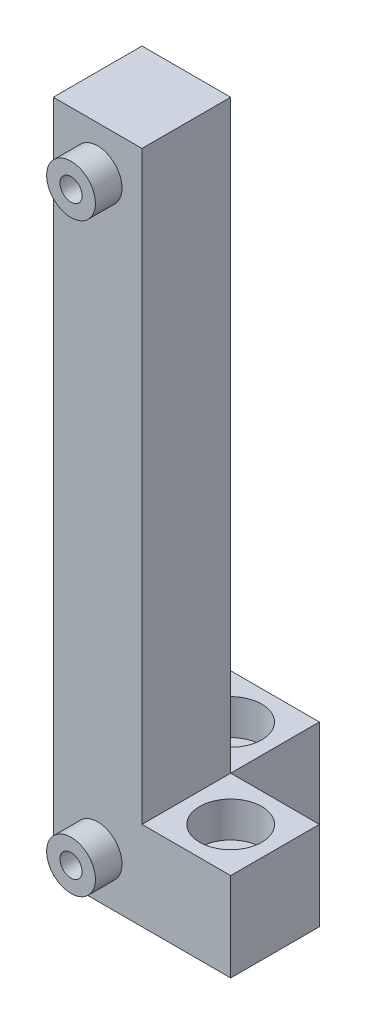
ISO-10303-21;
HEADER;
FILE_DESCRIPTION(('STEP AP214'),'2;1');
FILE_NAME('part.step','',(''),(''),'','','');
FILE_SCHEMA(('AUTOMOTIVE_DESIGN { 1 0 10303 214 1 1 1 1 }'));
ENDSEC;
DATA;
#1=APPLICATION_CONTEXT('core data for automotive mechanical design processes');
#2=APPLICATION_PROTOCOL_DEFINITION('international standard','automotive_design',2000,#1);
#3=PRODUCT_CONTEXT('',#1,'mechanical');
#4=PRODUCT('Part','Part','',(#3));
#5=PRODUCT_RELATED_PRODUCT_CATEGORY('part','',(#4));
#6=PRODUCT_DEFINITION_FORMATION('','',#4);
#7=PRODUCT_DEFINITION_CONTEXT('part definition',#1,'design');
#8=PRODUCT_DEFINITION('design','',#6,#7);
#9=PRODUCT_DEFINITION_SHAPE('','',#8);
#10=(LENGTH_UNIT() NAMED_UNIT(*) SI_UNIT(.MILLI.,.METRE.));
#11=(NAMED_UNIT(*) PLANE_ANGLE_UNIT() SI_UNIT($,.RADIAN.));
#12=(NAMED_UNIT(*) SI_UNIT($,.STERADIAN.) SOLID_ANGLE_UNIT());
#13=UNCERTAINTY_MEASURE_WITH_UNIT(LENGTH_MEASURE(1.E-05),#10,'distance_accuracy_value','');
#14=(GEOMETRIC_REPRESENTATION_CONTEXT(3) GLOBAL_UNCERTAINTY_ASSIGNED_CONTEXT((#13)) GLOBAL_UNIT_ASSIGNED_CONTEXT((#10,
#11,#12)) REPRESENTATION_CONTEXT('',''));
#15=CARTESIAN_POINT('',(0.,0.,0.));
#16=DIRECTION('',(0.,0.,1.));
#17=DIRECTION('',(1.,0.,0.));
#18=AXIS2_PLACEMENT_3D('',#15,#16,#17);
#19=CARTESIAN_POINT('',(5.,-0.000999999999999265,-5.));
#20=DIRECTION('',(0.,1.,0.));
#21=DIRECTION('',(0.,0.,1.));
#22=AXIS2_PLACEMENT_3D('',#19,#20,#21);
#23=CYLINDRICAL_SURFACE('',#22,1.75);
#24=CARTESIAN_POINT('',(5.,0.,-5.));
#25=DIRECTION('',(0.,1.,0.));
#26=DIRECTION('',(-1.,0.,0.));
#27=AXIS2_PLACEMENT_3D('',#24,#25,#26);
#28=CIRCLE('',#27,1.75);
#29=CARTESIAN_POINT('',(3.25,0.,-5.));
#30=VERTEX_POINT('',#29);
#31=EDGE_CURVE('E201',#30,#30,#28,.F.);
#32=ORIENTED_EDGE('',*,*,#31,.T.);
#33=EDGE_LOOP('',(#32));
#34=FACE_BOUND('',#33,.T.);
#35=CARTESIAN_POINT('',(5.,6.,-5.));
#36=DIRECTION('',(0.,1.,0.));
#37=DIRECTION('',(0.,0.,1.));
#38=AXIS2_PLACEMENT_3D('',#35,#36,#37);
#39=CIRCLE('',#38,1.75);
#40=CARTESIAN_POINT('',(5.,6.,-3.25));
#41=VERTEX_POINT('',#40);
#42=EDGE_CURVE('E38',#41,#41,#39,.F.);
#43=ORIENTED_EDGE('',*,*,#42,.F.);
#44=EDGE_LOOP('',(#43));
#45=FACE_BOUND('',#44,.T.);
#46=ADVANCED_FACE('F34',(#34,#45),#23,.F.);
#47=CARTESIAN_POINT('',(15.,-0.000999999999999265,5.));
#48=DIRECTION('',(0.,1.,0.));
#49=DIRECTION('',(0.,0.,1.));
#50=AXIS2_PLACEMENT_3D('',#47,#48,#49);
#51=CYLINDRICAL_SURFACE('',#50,1.75);
#52=CARTESIAN_POINT('',(15.,0.,5.));
#53=DIRECTION('',(0.,1.,0.));
#54=DIRECTION('',(-1.,0.,0.));
#55=AXIS2_PLACEMENT_3D('',#52,#53,#54);
#56=CIRCLE('',#55,1.75);
#57=CARTESIAN_POINT('',(13.25,0.,5.));
#58=VERTEX_POINT('',#57);
#59=EDGE_CURVE('E216',#58,#58,#56,.F.);
#60=ORIENTED_EDGE('',*,*,#59,.T.);
#61=EDGE_LOOP('',(#60));
#62=FACE_BOUND('',#61,.T.);
#63=CARTESIAN_POINT('',(15.,6.,5.));
#64=DIRECTION('',(0.,1.,0.));
#65=DIRECTION('',(0.,0.,1.));
#66=AXIS2_PLACEMENT_3D('',#63,#64,#65);
#67=CIRCLE('',#66,1.75);
#68=CARTESIAN_POINT('',(15.,6.,6.75));
#69=VERTEX_POINT('',#68);
#70=EDGE_CURVE('E195',#69,#69,#67,.F.);
#71=ORIENTED_EDGE('',*,*,#70,.F.);
#72=EDGE_LOOP('',(#71));
#73=FACE_BOUND('',#72,.T.);
#74=ADVANCED_FACE('F247',(#62,#73),#51,.F.);
#75=CARTESIAN_POINT('',(0.,0.,0.));
#76=DIRECTION('',(0.,0.,-1.));
#77=DIRECTION('',(-1.,0.,0.));
#78=AXIS2_PLACEMENT_3D('',#75,#76,#77);
#79=PLANE('',#78);
#80=DIRECTION('',(0.,-1.,0.));
#81=VECTOR('',#80,1.);
#82=CARTESIAN_POINT('',(10.,10.,0.));
#83=LINE('',#82,#81);
#84=CARTESIAN_POINT('',(10.,10.,0.));
#85=VERTEX_POINT('',#84);
#86=CARTESIAN_POINT('',(10.,0.,0.));
#87=VERTEX_POINT('',#86);
#88=EDGE_CURVE('E127',#85,#87,#83,.T.);
#89=ORIENTED_EDGE('',*,*,#88,.F.);
#90=DIRECTION('',(-1.,0.,0.));
#91=VECTOR('',#90,1.);
#92=CARTESIAN_POINT('',(10.,10.,0.));
#93=LINE('',#92,#91);
#94=CARTESIAN_POINT('',(20.,10.,0.));
#95=VERTEX_POINT('',#94);
#96=EDGE_CURVE('E173',#95,#85,#93,.T.);
#97=ORIENTED_EDGE('',*,*,#96,.F.);
#98=DIRECTION('',(0.,1.,0.));
#99=VECTOR('',#98,1.);
#100=CARTESIAN_POINT('',(20.,10.,0.));
#101=LINE('',#100,#99);
#102=CARTESIAN_POINT('',(20.,0.,0.));
#103=VERTEX_POINT('',#102);
#104=EDGE_CURVE('E171',#103,#95,#101,.T.);
#105=ORIENTED_EDGE('',*,*,#104,.F.);
#106=DIRECTION('',(1.,0.,0.));
#107=VECTOR('',#106,1.);
#108=CARTESIAN_POINT('',(20.,0.,0.));
#109=LINE('',#108,#107);
#110=EDGE_CURVE('E51',#87,#103,#109,.T.);
#111=ORIENTED_EDGE('',*,*,#110,.F.);
#112=EDGE_LOOP('',(#89,#97,#105,#111));
#113=FACE_BOUND('',#112,.T.);
#114=ADVANCED_FACE('F245',(#113),#79,.T.);
#115=CARTESIAN_POINT('',(0.,0.,10.));
#116=DIRECTION('',(1.,0.,0.));
#117=DIRECTION('',(0.,0.,-1.));
#118=AXIS2_PLACEMENT_3D('',#115,#116,#117);
#119=PLANE('',#118);
#120=DIRECTION('',(0.,-1.,0.));
#121=VECTOR('',#120,1.);
#122=CARTESIAN_POINT('',(0.,0.,0.));
#123=LINE('',#122,#121);
#124=CARTESIAN_POINT('',(0.,76.,0.));
#125=VERTEX_POINT('',#124);
#126=CARTESIAN_POINT('',(0.,10.,0.));
#127=VERTEX_POINT('',#126);
#128=EDGE_CURVE('E153',#125,#127,#123,.T.);
#129=ORIENTED_EDGE('',*,*,#128,.T.);
#130=DIRECTION('',(0.,0.,1.));
#131=VECTOR('',#130,1.);
#132=CARTESIAN_POINT('',(0.,10.,-10.));
#133=LINE('',#132,#131);
#134=CARTESIAN_POINT('',(0.,10.,-10.));
#135=VERTEX_POINT('',#134);
#136=EDGE_CURVE('E129',#135,#127,#133,.T.);
#137=ORIENTED_EDGE('',*,*,#136,.F.);
#138=DIRECTION('',(0.,1.,0.));
#139=VECTOR('',#138,1.);
#140=CARTESIAN_POINT('',(0.,10.,-10.));
#141=LINE('',#140,#139);
#142=CARTESIAN_POINT('',(0.,0.,-10.));
#143=VERTEX_POINT('',#142);
#144=EDGE_CURVE('E115',#143,#135,#141,.T.);
#145=ORIENTED_EDGE('',*,*,#144,.F.);
#146=DIRECTION('',(0.,0.,-1.));
#147=VECTOR('',#146,1.);
#148=CARTESIAN_POINT('',(0.,0.,10.));
#149=LINE('',#148,#147);
#150=CARTESIAN_POINT('',(0.,0.,10.));
#151=VERTEX_POINT('',#150);
#152=EDGE_CURVE('E112',#151,#143,#149,.T.);
#153=ORIENTED_EDGE('',*,*,#152,.F.);
#154=DIRECTION('',(0.,-1.,0.));
#155=VECTOR('',#154,1.);
#156=CARTESIAN_POINT('',(0.,0.,10.));
#157=LINE('',#156,#155);
#158=CARTESIAN_POINT('',(0.,76.,10.));
#159=VERTEX_POINT('',#158);
#160=EDGE_CURVE('E154',#159,#151,#157,.T.);
#161=ORIENTED_EDGE('',*,*,#160,.F.);
#162=DIRECTION('',(0.,0.,-1.));
#163=VECTOR('',#162,1.);
#164=CARTESIAN_POINT('',(0.,76.,10.));
#165=LINE('',#164,#163);
#166=EDGE_CURVE('E168',#159,#125,#165,.T.);
#167=ORIENTED_EDGE('',*,*,#166,.T.);
#168=EDGE_LOOP('',(#129,#137,#145,#153,#161,#167));
#169=FACE_BOUND('',#168,.T.);
#170=ADVANCED_FACE('F36',(#169),#119,.F.);
#171=CARTESIAN_POINT('',(20.,0.,10.));
#172=DIRECTION('',(0.,1.,0.));
#173=DIRECTION('',(-1.,0.,0.));
#174=AXIS2_PLACEMENT_3D('',#171,#172,#173);
#175=PLANE('',#174);
#176=ORIENTED_EDGE('',*,*,#59,.F.);
#177=EDGE_LOOP('',(#176));
#178=FACE_BOUND('',#177,.T.);
#179=ORIENTED_EDGE('',*,*,#31,.F.);
#180=EDGE_LOOP('',(#179));
#181=FACE_BOUND('',#180,.T.);
#182=ORIENTED_EDGE('',*,*,#152,.T.);
#183=DIRECTION('',(-1.,0.,0.));
#184=VECTOR('',#183,1.);
#185=CARTESIAN_POINT('',(10.,0.,-10.));
#186=LINE('',#185,#184);
#187=CARTESIAN_POINT('',(10.,0.,-10.));
#188=VERTEX_POINT('',#187);
#189=EDGE_CURVE('E105',#188,#143,#186,.T.);
#190=ORIENTED_EDGE('',*,*,#189,.F.);
#191=DIRECTION('',(0.,0.,1.));
#192=VECTOR('',#191,1.);
#193=CARTESIAN_POINT('',(10.,0.,-10.));
#194=LINE('',#193,#192);
#195=EDGE_CURVE('E109',#188,#87,#194,.T.);
#196=ORIENTED_EDGE('',*,*,#195,.T.);
#197=ORIENTED_EDGE('',*,*,#110,.T.);
#198=DIRECTION('',(0.,0.,-1.));
#199=VECTOR('',#198,1.);
#200=CARTESIAN_POINT('',(20.,0.,10.));
#201=LINE('',#200,#199);
#202=CARTESIAN_POINT('',(20.,0.,10.));
#203=VERTEX_POINT('',#202);
#204=EDGE_CURVE('E190',#203,#103,#201,.T.);
#205=ORIENTED_EDGE('',*,*,#204,.F.);
#206=DIRECTION('',(1.,0.,0.));
#207=VECTOR('',#206,1.);
#208=CARTESIAN_POINT('',(20.,0.,10.));
#209=LINE('',#208,#207);
#210=EDGE_CURVE('E157',#151,#203,#209,.T.);
#211=ORIENTED_EDGE('',*,*,#210,.F.);
#212=EDGE_LOOP('',(#182,#190,#196,#197,#205,#211));
#213=FACE_BOUND('',#212,.T.);
#214=ADVANCED_FACE('F107',(#178,#181,#213),#175,.F.);
#215=CARTESIAN_POINT('',(20.,10.,10.));
#216=DIRECTION('',(-1.,0.,0.));
#217=DIRECTION('',(0.,-1.,0.));
#218=AXIS2_PLACEMENT_3D('',#215,#216,#217);
#219=PLANE('',#218);
#220=ORIENTED_EDGE('',*,*,#104,.T.);
#221=DIRECTION('',(0.,0.,-1.));
#222=VECTOR('',#221,1.);
#223=CARTESIAN_POINT('',(20.,10.,10.));
#224=LINE('',#223,#222);
#225=CARTESIAN_POINT('',(20.,10.,10.));
#226=VERTEX_POINT('',#225);
#227=EDGE_CURVE('E187',#226,#95,#224,.T.);
#228=ORIENTED_EDGE('',*,*,#227,.F.);
#229=DIRECTION('',(0.,1.,0.));
#230=VECTOR('',#229,1.);
#231=CARTESIAN_POINT('',(20.,10.,10.));
#232=LINE('',#231,#230);
#233=EDGE_CURVE('E160',#203,#226,#232,.T.);
#234=ORIENTED_EDGE('',*,*,#233,.F.);
#235=ORIENTED_EDGE('',*,*,#204,.T.);
#236=EDGE_LOOP('',(#220,#228,#234,#235));
#237=FACE_BOUND('',#236,.T.);
#238=ADVANCED_FACE('F318',(#237),#219,.F.);
#239=CARTESIAN_POINT('',(10.,10.,10.));
#240=DIRECTION('',(0.,-1.,0.));
#241=DIRECTION('',(0.,0.,-1.));
#242=AXIS2_PLACEMENT_3D('',#239,#240,#241);
#243=PLANE('',#242);
#244=CARTESIAN_POINT('',(15.,10.,5.));
#245=DIRECTION('',(0.,1.,0.));
#246=DIRECTION('',(0.,0.,1.));
#247=AXIS2_PLACEMENT_3D('',#244,#245,#246);
#248=CIRCLE('',#247,3.5);
#249=CARTESIAN_POINT('',(15.,10.,8.5));
#250=VERTEX_POINT('',#249);
#251=EDGE_CURVE('E203',#250,#250,#248,.T.);
#252=ORIENTED_EDGE('',*,*,#251,.F.);
#253=EDGE_LOOP('',(#252));
#254=FACE_BOUND('',#253,.T.);
#255=ORIENTED_EDGE('',*,*,#96,.T.);
#256=DIRECTION('',(0.,0.,-1.));
#257=VECTOR('',#256,1.);
#258=CARTESIAN_POINT('',(10.,10.,10.));
#259=LINE('',#258,#257);
#260=CARTESIAN_POINT('',(10.,10.,10.));
#261=VERTEX_POINT('',#260);
#262=EDGE_CURVE('E184',#261,#85,#259,.T.);
#263=ORIENTED_EDGE('',*,*,#262,.F.);
#264=DIRECTION('',(-1.,0.,0.));
#265=VECTOR('',#264,1.);
#266=CARTESIAN_POINT('',(10.,10.,10.));
#267=LINE('',#266,#265);
#268=EDGE_CURVE('E162',#226,#261,#267,.T.);
#269=ORIENTED_EDGE('',*,*,#268,.F.);
#270=ORIENTED_EDGE('',*,*,#227,.T.);
#271=EDGE_LOOP('',(#255,#263,#269,#270));
#272=FACE_BOUND('',#271,.T.);
#273=ADVANCED_FACE('F243',(#254,#272),#243,.F.);
#274=CARTESIAN_POINT('',(10.,76.,10.));
#275=DIRECTION('',(-1.,0.,0.));
#276=DIRECTION('',(0.,-1.,0.));
#277=AXIS2_PLACEMENT_3D('',#274,#275,#276);
#278=PLANE('',#277);
#279=DIRECTION('',(0.,1.,0.));
#280=VECTOR('',#279,1.);
#281=CARTESIAN_POINT('',(10.,76.,0.));
#282=LINE('',#281,#280);
#283=CARTESIAN_POINT('',(10.,76.,0.));
#284=VERTEX_POINT('',#283);
#285=EDGE_CURVE('E176',#85,#284,#282,.T.);
#286=ORIENTED_EDGE('',*,*,#285,.T.);
#287=DIRECTION('',(0.,0.,-1.));
#288=VECTOR('',#287,1.);
#289=CARTESIAN_POINT('',(10.,76.,10.));
#290=LINE('',#289,#288);
#291=CARTESIAN_POINT('',(10.,76.,10.));
#292=VERTEX_POINT('',#291);
#293=EDGE_CURVE('E181',#292,#284,#290,.T.);
#294=ORIENTED_EDGE('',*,*,#293,.F.);
#295=DIRECTION('',(0.,1.,0.));
#296=VECTOR('',#295,1.);
#297=CARTESIAN_POINT('',(10.,76.,10.));
#298=LINE('',#297,#296);
#299=EDGE_CURVE('E164',#261,#292,#298,.T.);
#300=ORIENTED_EDGE('',*,*,#299,.F.);
#301=ORIENTED_EDGE('',*,*,#262,.T.);
#302=EDGE_LOOP('',(#286,#294,#300,#301));
#303=FACE_BOUND('',#302,.T.);
#304=ADVANCED_FACE('F238',(#303),#278,.F.);
#305=CARTESIAN_POINT('',(0.,76.,10.));
#306=DIRECTION('',(0.,-1.,0.));
#307=DIRECTION('',(0.,0.,-1.));
#308=AXIS2_PLACEMENT_3D('',#305,#306,#307);
#309=PLANE('',#308);
#310=DIRECTION('',(-1.,0.,0.));
#311=VECTOR('',#310,1.);
#312=CARTESIAN_POINT('',(0.,76.,0.));
#313=LINE('',#312,#311);
#314=EDGE_CURVE('E158',#284,#125,#313,.T.);
#315=ORIENTED_EDGE('',*,*,#314,.T.);
#316=ORIENTED_EDGE('',*,*,#166,.F.);
#317=DIRECTION('',(-1.,0.,0.));
#318=VECTOR('',#317,1.);
#319=CARTESIAN_POINT('',(0.,76.,10.));
#320=LINE('',#319,#318);
#321=EDGE_CURVE('E166',#292,#159,#320,.T.);
#322=ORIENTED_EDGE('',*,*,#321,.F.);
#323=ORIENTED_EDGE('',*,*,#293,.T.);
#324=EDGE_LOOP('',(#315,#316,#322,#323));
#325=FACE_BOUND('',#324,.T.);
#326=ADVANCED_FACE('F233',(#325),#309,.F.);
#327=CARTESIAN_POINT('',(0.,0.,10.));
#328=DIRECTION('',(0.,0.,-1.));
#329=DIRECTION('',(-1.,0.,0.));
#330=AXIS2_PLACEMENT_3D('',#327,#328,#329);
#331=PLANE('',#330);
#332=CARTESIAN_POINT('',(5.,5.,10.));
#333=DIRECTION('',(0.,0.,-1.));
#334=DIRECTION('',(-1.,0.,0.));
#335=AXIS2_PLACEMENT_3D('',#332,#333,#334);
#336=CIRCLE('',#335,2.75);
#337=CARTESIAN_POINT('',(2.25,5.,10.));
#338=VERTEX_POINT('',#337);
#339=EDGE_CURVE('E11',#338,#338,#336,.F.);
#340=ORIENTED_EDGE('',*,*,#339,.F.);
#341=EDGE_LOOP('',(#340));
#342=FACE_BOUND('',#341,.T.);
#343=CARTESIAN_POINT('',(5.,71.,10.));
#344=DIRECTION('',(0.,0.,-1.));
#345=DIRECTION('',(-1.,0.,0.));
#346=AXIS2_PLACEMENT_3D('',#343,#344,#345);
#347=CIRCLE('',#346,2.75);
#348=CARTESIAN_POINT('',(2.25,71.,10.));
#349=VERTEX_POINT('',#348);
#350=EDGE_CURVE('E43',#349,#349,#347,.F.);
#351=ORIENTED_EDGE('',*,*,#350,.F.);
#352=EDGE_LOOP('',(#351));
#353=FACE_BOUND('',#352,.T.);
#354=ORIENTED_EDGE('',*,*,#160,.T.);
#355=ORIENTED_EDGE('',*,*,#210,.T.);
#356=ORIENTED_EDGE('',*,*,#233,.T.);
#357=ORIENTED_EDGE('',*,*,#268,.T.);
#358=ORIENTED_EDGE('',*,*,#299,.T.);
#359=ORIENTED_EDGE('',*,*,#321,.T.);
#360=EDGE_LOOP('',(#354,#355,#356,#357,#358,#359));
#361=FACE_BOUND('',#360,.T.);
#362=ADVANCED_FACE('F259',(#342,#353,#361),#331,.F.);
#363=DIRECTION('',(1.,0.,0.));
#364=VECTOR('',#363,1.);
#365=CARTESIAN_POINT('',(10.,10.,0.));
#366=LINE('',#365,#364);
#367=EDGE_CURVE('E59',#127,#85,#366,.T.);
#368=ORIENTED_EDGE('',*,*,#367,.F.);
#369=ORIENTED_EDGE('',*,*,#128,.F.);
#370=ORIENTED_EDGE('',*,*,#314,.F.);
#371=ORIENTED_EDGE('',*,*,#285,.F.);
#372=EDGE_LOOP('',(#368,#369,#370,#371));
#373=FACE_BOUND('',#372,.T.);
#374=ADVANCED_FACE('F231',(#373),#79,.T.);
#375=CARTESIAN_POINT('',(5.,71.,13.));
#376=DIRECTION('',(0.,0.,-1.));
#377=DIRECTION('',(-1.,0.,0.));
#378=AXIS2_PLACEMENT_3D('',#375,#376,#377);
#379=CYLINDRICAL_SURFACE('',#378,2.75);
#380=CARTESIAN_POINT('',(5.,71.,13.));
#381=DIRECTION('',(0.,0.,1.));
#382=DIRECTION('',(1.,0.,0.));
#383=AXIS2_PLACEMENT_3D('',#380,#381,#382);
#384=CIRCLE('',#383,2.75);
#385=CARTESIAN_POINT('',(7.75,71.,13.));
#386=VERTEX_POINT('',#385);
#387=EDGE_CURVE('E150',#386,#386,#384,.T.);
#388=ORIENTED_EDGE('',*,*,#387,.F.);
#389=EDGE_LOOP('',(#388));
#390=FACE_BOUND('',#389,.T.);
#391=ORIENTED_EDGE('',*,*,#350,.T.);
#392=EDGE_LOOP('',(#391));
#393=FACE_BOUND('',#392,.T.);
#394=ADVANCED_FACE('F258',(#390,#393),#379,.T.);
#395=CARTESIAN_POINT('',(5.,71.,13.));
#396=DIRECTION('',(0.,0.,1.));
#397=DIRECTION('',(1.,0.,0.));
#398=AXIS2_PLACEMENT_3D('',#395,#396,#397);
#399=PLANE('',#398);
#400=CARTESIAN_POINT('',(5.,71.,13.));
#401=DIRECTION('',(0.,0.,1.));
#402=DIRECTION('',(1.,0.,0.));
#403=AXIS2_PLACEMENT_3D('',#400,#401,#402);
#404=CIRCLE('',#403,1.25);
#405=CARTESIAN_POINT('',(6.25,71.,13.));
#406=VERTEX_POINT('',#405);
#407=EDGE_CURVE('E143',#406,#406,#404,.T.);
#408=ORIENTED_EDGE('',*,*,#407,.F.);
#409=EDGE_LOOP('',(#408));
#410=FACE_BOUND('',#409,.T.);
#411=ORIENTED_EDGE('',*,*,#387,.T.);
#412=EDGE_LOOP('',(#411));
#413=FACE_BOUND('',#412,.T.);
#414=ADVANCED_FACE('F299',(#410,#413),#399,.T.);
#415=CARTESIAN_POINT('',(5.,5.,13.));
#416=DIRECTION('',(0.,0.,-1.));
#417=DIRECTION('',(-1.,0.,0.));
#418=AXIS2_PLACEMENT_3D('',#415,#416,#417);
#419=CYLINDRICAL_SURFACE('',#418,2.75);
#420=CARTESIAN_POINT('',(5.,5.,13.));
#421=DIRECTION('',(0.,0.,1.));
#422=DIRECTION('',(1.,0.,0.));
#423=AXIS2_PLACEMENT_3D('',#420,#421,#422);
#424=CIRCLE('',#423,2.75);
#425=CARTESIAN_POINT('',(7.75,5.,13.));
#426=VERTEX_POINT('',#425);
#427=EDGE_CURVE('E142',#426,#426,#424,.T.);
#428=ORIENTED_EDGE('',*,*,#427,.F.);
#429=EDGE_LOOP('',(#428));
#430=FACE_BOUND('',#429,.T.);
#431=ORIENTED_EDGE('',*,*,#339,.T.);
#432=EDGE_LOOP('',(#431));
#433=FACE_BOUND('',#432,.T.);
#434=ADVANCED_FACE('F295',(#430,#433),#419,.T.);
#435=CARTESIAN_POINT('',(5.,5.,13.));
#436=DIRECTION('',(0.,0.,1.));
#437=DIRECTION('',(1.,0.,0.));
#438=AXIS2_PLACEMENT_3D('',#435,#436,#437);
#439=PLANE('',#438);
#440=CARTESIAN_POINT('',(5.,5.,13.));
#441=DIRECTION('',(0.,0.,1.));
#442=DIRECTION('',(1.,0.,0.));
#443=AXIS2_PLACEMENT_3D('',#440,#441,#442);
#444=CIRCLE('',#443,1.25);
#445=CARTESIAN_POINT('',(6.25,5.,13.));
#446=VERTEX_POINT('',#445);
#447=EDGE_CURVE('E128',#446,#446,#444,.T.);
#448=ORIENTED_EDGE('',*,*,#447,.F.);
#449=EDGE_LOOP('',(#448));
#450=FACE_BOUND('',#449,.T.);
#451=ORIENTED_EDGE('',*,*,#427,.T.);
#452=EDGE_LOOP('',(#451));
#453=FACE_BOUND('',#452,.T.);
#454=ADVANCED_FACE('F291',(#450,#453),#439,.T.);
#455=CARTESIAN_POINT('',(5.,5.,5.));
#456=DIRECTION('',(0.,0.,1.));
#457=DIRECTION('',(1.,0.,0.));
#458=AXIS2_PLACEMENT_3D('',#455,#456,#457);
#459=CYLINDRICAL_SURFACE('',#458,1.25);
#460=CARTESIAN_POINT('',(5.,5.,5.));
#461=DIRECTION('',(0.,0.,1.));
#462=DIRECTION('',(1.,0.,0.));
#463=AXIS2_PLACEMENT_3D('',#460,#461,#462);
#464=CIRCLE('',#463,1.25);
#465=CARTESIAN_POINT('',(6.25,5.,5.));
#466=VERTEX_POINT('',#465);
#467=EDGE_CURVE('E132',#466,#466,#464,.T.);
#468=ORIENTED_EDGE('',*,*,#467,.F.);
#469=EDGE_LOOP('',(#468));
#470=FACE_BOUND('',#469,.T.);
#471=ORIENTED_EDGE('',*,*,#447,.T.);
#472=EDGE_LOOP('',(#471));
#473=FACE_BOUND('',#472,.T.);
#474=ADVANCED_FACE('F287',(#470,#473),#459,.F.);
#475=CARTESIAN_POINT('',(5.,5.,5.));
#476=DIRECTION('',(0.,0.,1.));
#477=DIRECTION('',(1.,0.,0.));
#478=AXIS2_PLACEMENT_3D('',#475,#476,#477);
#479=PLANE('',#478);
#480=ORIENTED_EDGE('',*,*,#467,.T.);
#481=EDGE_LOOP('',(#480));
#482=FACE_BOUND('',#481,.T.);
#483=ADVANCED_FACE('F283',(#482),#479,.T.);
#484=CARTESIAN_POINT('',(5.,71.,5.));
#485=DIRECTION('',(0.,0.,1.));
#486=DIRECTION('',(1.,0.,0.));
#487=AXIS2_PLACEMENT_3D('',#484,#485,#486);
#488=CYLINDRICAL_SURFACE('',#487,1.25);
#489=CARTESIAN_POINT('',(5.,71.,5.));
#490=DIRECTION('',(0.,0.,1.));
#491=DIRECTION('',(1.,0.,0.));
#492=AXIS2_PLACEMENT_3D('',#489,#490,#491);
#493=CIRCLE('',#492,1.25);
#494=CARTESIAN_POINT('',(6.25,71.,5.));
#495=VERTEX_POINT('',#494);
#496=EDGE_CURVE('E139',#495,#495,#493,.T.);
#497=ORIENTED_EDGE('',*,*,#496,.F.);
#498=EDGE_LOOP('',(#497));
#499=FACE_BOUND('',#498,.T.);
#500=ORIENTED_EDGE('',*,*,#407,.T.);
#501=EDGE_LOOP('',(#500));
#502=FACE_BOUND('',#501,.T.);
#503=ADVANCED_FACE('F279',(#499,#502),#488,.F.);
#504=CARTESIAN_POINT('',(5.,71.,5.));
#505=DIRECTION('',(0.,0.,1.));
#506=DIRECTION('',(1.,0.,0.));
#507=AXIS2_PLACEMENT_3D('',#504,#505,#506);
#508=PLANE('',#507);
#509=ORIENTED_EDGE('',*,*,#496,.T.);
#510=EDGE_LOOP('',(#509));
#511=FACE_BOUND('',#510,.T.);
#512=ADVANCED_FACE('F276',(#511),#508,.T.);
#513=CARTESIAN_POINT('',(10.,10.,-10.));
#514=DIRECTION('',(-1.,0.,0.));
#515=DIRECTION('',(0.,0.,1.));
#516=AXIS2_PLACEMENT_3D('',#513,#514,#515);
#517=PLANE('',#516);
#518=ORIENTED_EDGE('',*,*,#88,.T.);
#519=ORIENTED_EDGE('',*,*,#195,.F.);
#520=DIRECTION('',(0.,-1.,0.));
#521=VECTOR('',#520,1.);
#522=CARTESIAN_POINT('',(10.,10.,-10.));
#523=LINE('',#522,#521);
#524=CARTESIAN_POINT('',(10.,10.,-10.));
#525=VERTEX_POINT('',#524);
#526=EDGE_CURVE('E116',#525,#188,#523,.T.);
#527=ORIENTED_EDGE('',*,*,#526,.F.);
#528=DIRECTION('',(0.,0.,1.));
#529=VECTOR('',#528,1.);
#530=CARTESIAN_POINT('',(10.,10.,-10.));
#531=LINE('',#530,#529);
#532=EDGE_CURVE('E135',#525,#85,#531,.T.);
#533=ORIENTED_EDGE('',*,*,#532,.T.);
#534=EDGE_LOOP('',(#518,#519,#527,#533));
#535=FACE_BOUND('',#534,.T.);
#536=ADVANCED_FACE('F126',(#535),#517,.F.);
#537=CARTESIAN_POINT('',(10.,10.,-10.));
#538=DIRECTION('',(0.,-1.,0.));
#539=DIRECTION('',(0.,0.,-1.));
#540=AXIS2_PLACEMENT_3D('',#537,#538,#539);
#541=PLANE('',#540);
#542=CARTESIAN_POINT('',(5.,10.,-5.));
#543=DIRECTION('',(0.,1.,0.));
#544=DIRECTION('',(0.,0.,1.));
#545=AXIS2_PLACEMENT_3D('',#542,#543,#544);
#546=CIRCLE('',#545,3.5);
#547=CARTESIAN_POINT('',(5.,10.,-1.5));
#548=VERTEX_POINT('',#547);
#549=EDGE_CURVE('E213',#548,#548,#546,.T.);
#550=ORIENTED_EDGE('',*,*,#549,.F.);
#551=EDGE_LOOP('',(#550));
#552=FACE_BOUND('',#551,.T.);
#553=ORIENTED_EDGE('',*,*,#367,.T.);
#554=ORIENTED_EDGE('',*,*,#532,.F.);
#555=DIRECTION('',(1.,0.,0.));
#556=VECTOR('',#555,1.);
#557=CARTESIAN_POINT('',(10.,10.,-10.));
#558=LINE('',#557,#556);
#559=EDGE_CURVE('E121',#135,#525,#558,.T.);
#560=ORIENTED_EDGE('',*,*,#559,.F.);
#561=ORIENTED_EDGE('',*,*,#136,.T.);
#562=EDGE_LOOP('',(#553,#554,#560,#561));
#563=FACE_BOUND('',#562,.T.);
#564=ADVANCED_FACE('F225',(#552,#563),#541,.F.);
#565=CARTESIAN_POINT('',(0.,0.,-10.));
#566=DIRECTION('',(0.,0.,-1.));
#567=DIRECTION('',(-1.,0.,0.));
#568=AXIS2_PLACEMENT_3D('',#565,#566,#567);
#569=PLANE('',#568);
#570=ORIENTED_EDGE('',*,*,#526,.T.);
#571=ORIENTED_EDGE('',*,*,#189,.T.);
#572=ORIENTED_EDGE('',*,*,#144,.T.);
#573=ORIENTED_EDGE('',*,*,#559,.T.);
#574=EDGE_LOOP('',(#570,#571,#572,#573));
#575=FACE_BOUND('',#574,.T.);
#576=ADVANCED_FACE('F119',(#575),#569,.T.);
#577=CARTESIAN_POINT('',(15.,6.,5.));
#578=DIRECTION('',(0.,1.,0.));
#579=DIRECTION('',(0.,0.,1.));
#580=AXIS2_PLACEMENT_3D('',#577,#578,#579);
#581=PLANE('',#580);
#582=CARTESIAN_POINT('',(15.,6.,5.));
#583=DIRECTION('',(0.,1.,0.));
#584=DIRECTION('',(0.,0.,1.));
#585=AXIS2_PLACEMENT_3D('',#582,#583,#584);
#586=CIRCLE('',#585,3.5);
#587=CARTESIAN_POINT('',(15.,6.,8.5));
#588=VERTEX_POINT('',#587);
#589=EDGE_CURVE('E197',#588,#588,#586,.T.);
#590=ORIENTED_EDGE('',*,*,#589,.T.);
#591=EDGE_LOOP('',(#590));
#592=FACE_BOUND('',#591,.T.);
#593=ORIENTED_EDGE('',*,*,#70,.T.);
#594=EDGE_LOOP('',(#593));
#595=FACE_BOUND('',#594,.T.);
#596=ADVANCED_FACE('F270',(#592,#595),#581,.T.);
#597=CARTESIAN_POINT('',(15.,6.,5.));
#598=DIRECTION('',(0.,1.,0.));
#599=DIRECTION('',(0.,0.,1.));
#600=AXIS2_PLACEMENT_3D('',#597,#598,#599);
#601=CYLINDRICAL_SURFACE('',#600,3.5);
#602=ORIENTED_EDGE('',*,*,#589,.F.);
#603=EDGE_LOOP('',(#602));
#604=FACE_BOUND('',#603,.T.);
#605=ORIENTED_EDGE('',*,*,#251,.T.);
#606=EDGE_LOOP('',(#605));
#607=FACE_BOUND('',#606,.T.);
#608=ADVANCED_FACE('F456',(#604,#607),#601,.F.);
#609=CARTESIAN_POINT('',(5.,6.,-5.));
#610=DIRECTION('',(0.,1.,0.));
#611=DIRECTION('',(0.,0.,1.));
#612=AXIS2_PLACEMENT_3D('',#609,#610,#611);
#613=PLANE('',#612);
#614=CARTESIAN_POINT('',(5.,6.,-5.));
#615=DIRECTION('',(0.,1.,0.));
#616=DIRECTION('',(0.,0.,1.));
#617=AXIS2_PLACEMENT_3D('',#614,#615,#616);
#618=CIRCLE('',#617,3.5);
#619=CARTESIAN_POINT('',(5.,6.,-1.5));
#620=VERTEX_POINT('',#619);
#621=EDGE_CURVE('E208',#620,#620,#618,.T.);
#622=ORIENTED_EDGE('',*,*,#621,.T.);
#623=EDGE_LOOP('',(#622));
#624=FACE_BOUND('',#623,.T.);
#625=ORIENTED_EDGE('',*,*,#42,.T.);
#626=EDGE_LOOP('',(#625));
#627=FACE_BOUND('',#626,.T.);
#628=ADVANCED_FACE('F465',(#624,#627),#613,.T.);
#629=CARTESIAN_POINT('',(5.,6.,-5.));
#630=DIRECTION('',(0.,1.,0.));
#631=DIRECTION('',(0.,0.,1.));
#632=AXIS2_PLACEMENT_3D('',#629,#630,#631);
#633=CYLINDRICAL_SURFACE('',#632,3.5);
#634=ORIENTED_EDGE('',*,*,#621,.F.);
#635=EDGE_LOOP('',(#634));
#636=FACE_BOUND('',#635,.T.);
#637=ORIENTED_EDGE('',*,*,#549,.T.);
#638=EDGE_LOOP('',(#637));
#639=FACE_BOUND('',#638,.T.);
#640=ADVANCED_FACE('F475',(#636,#639),#633,.F.);
#641=CLOSED_SHELL('',(#46,#74,#114,#170,#214,#238,#273,#304,#326,#362,#374,#394,#414,#434,#454,
#474,#483,#503,#512,#536,#564,#576,#596,#608,#628,#640));
#642=MANIFOLD_SOLID_BREP('B2',#641);
#643=ADVANCED_BREP_SHAPE_REPRESENTATION('',(#18,#642),#14);
#644=SHAPE_DEFINITION_REPRESENTATION(#9,#643);
ENDSEC;
END-ISO-10303-21;
